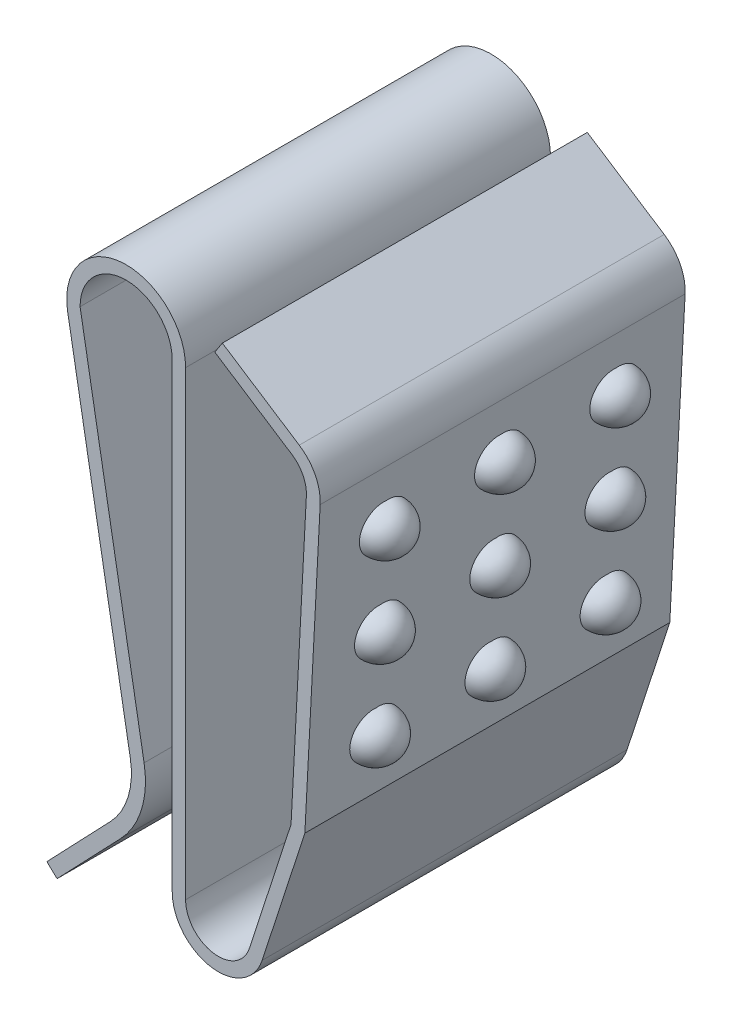
ISO-10303-21;
HEADER;
FILE_DESCRIPTION(('STEP AP214'),'2;1');
FILE_NAME('part.step','',(''),(''),'','','');
FILE_SCHEMA(('AUTOMOTIVE_DESIGN { 1 0 10303 214 1 1 1 1 }'));
ENDSEC;
DATA;
#1=APPLICATION_CONTEXT('core data for automotive mechanical design processes');
#2=APPLICATION_PROTOCOL_DEFINITION('international standard','automotive_design',2000,#1);
#3=PRODUCT_CONTEXT('',#1,'mechanical');
#4=PRODUCT('Part','Part','',(#3));
#5=PRODUCT_RELATED_PRODUCT_CATEGORY('part','',(#4));
#6=PRODUCT_DEFINITION_FORMATION('','',#4);
#7=PRODUCT_DEFINITION_CONTEXT('part definition',#1,'design');
#8=PRODUCT_DEFINITION('design','',#6,#7);
#9=PRODUCT_DEFINITION_SHAPE('','',#8);
#10=(LENGTH_UNIT() NAMED_UNIT(*) SI_UNIT(.MILLI.,.METRE.));
#11=(NAMED_UNIT(*) PLANE_ANGLE_UNIT() SI_UNIT($,.RADIAN.));
#12=(NAMED_UNIT(*) SI_UNIT($,.STERADIAN.) SOLID_ANGLE_UNIT());
#13=UNCERTAINTY_MEASURE_WITH_UNIT(LENGTH_MEASURE(1.E-05),#10,'distance_accuracy_value','');
#14=(GEOMETRIC_REPRESENTATION_CONTEXT(3) GLOBAL_UNCERTAINTY_ASSIGNED_CONTEXT((#13)) GLOBAL_UNIT_ASSIGNED_CONTEXT((#10,
#11,#12)) REPRESENTATION_CONTEXT('',''));
#15=CARTESIAN_POINT('',(0.,0.,0.));
#16=DIRECTION('',(0.,0.,1.));
#17=DIRECTION('',(1.,0.,0.));
#18=AXIS2_PLACEMENT_3D('',#15,#16,#17);
#19=CARTESIAN_POINT('',(0.,0.,7.91999999999999));
#20=DIRECTION('',(0.,0.,1.));
#21=DIRECTION('',(0.,-1.,0.));
#22=AXIS2_PLACEMENT_3D('',#19,#20,#21);
#23=PLANE('',#22);
#24=DIRECTION('',(0.,-1.,0.));
#25=VECTOR('',#24,1.);
#26=CARTESIAN_POINT('',(0.,5.,7.92));
#27=LINE('',#26,#25);
#28=CARTESIAN_POINT('',(0.,5.,7.92));
#29=VERTEX_POINT('',#28);
#30=CARTESIAN_POINT('',(0.,-5.,7.92));
#31=VERTEX_POINT('',#30);
#32=EDGE_CURVE('E282',#29,#31,#27,.T.);
#33=ORIENTED_EDGE('',*,*,#32,.T.);
#34=CARTESIAN_POINT('',(1.,-5.,7.92));
#35=DIRECTION('',(0.,0.,1.));
#36=DIRECTION('',(1.,0.,0.));
#37=AXIS2_PLACEMENT_3D('',#34,#35,#36);
#38=CIRCLE('',#37,1.);
#39=CARTESIAN_POINT('',(1.95105651629516,-5.30901699437494,7.91999999999999));
#40=VERTEX_POINT('',#39);
#41=EDGE_CURVE('E43',#31,#40,#38,.T.);
#42=ORIENTED_EDGE('',*,*,#41,.T.);
#43=DIRECTION('',(0.309016994374941,0.951056516295155,0.));
#44=VECTOR('',#43,1.);
#45=CARTESIAN_POINT('',(1.95105651629516,-5.30901699437494,7.91999999999999));
#46=LINE('',#45,#44);
#47=CARTESIAN_POINT('',(2.87810749941998,-2.45584744548947,7.91999999999999));
#48=VERTEX_POINT('',#47);
#49=EDGE_CURVE('E301',#40,#48,#46,.T.);
#50=ORIENTED_EDGE('',*,*,#49,.T.);
#51=DIRECTION('',(0.0523359562429509,0.998629534754574,0.));
#52=VECTOR('',#51,1.);
#53=CARTESIAN_POINT('',(2.87810749941998,-2.45584744548947,7.91999999999999));
#54=LINE('',#53,#52);
#55=CARTESIAN_POINT('',(3.21044082156272,3.88545010020207,7.91999999999999));
#56=VERTEX_POINT('',#55);
#57=EDGE_CURVE('E321',#48,#56,#54,.T.);
#58=ORIENTED_EDGE('',*,*,#57,.T.);
#59=CARTESIAN_POINT('',(2.21181128680814,3.93778605644502,7.92));
#60=DIRECTION('',(0.,0.,1.));
#61=DIRECTION('',(0.,-1.,0.));
#62=AXIS2_PLACEMENT_3D('',#59,#60,#61);
#63=CIRCLE('',#62,1.);
#64=CARTESIAN_POINT('',(2.75645032182317,4.77645662439044,7.91999999999999));
#65=VERTEX_POINT('',#64);
#66=EDGE_CURVE('E335',#56,#65,#63,.T.);
#67=ORIENTED_EDGE('',*,*,#66,.T.);
#68=DIRECTION('',(-0.838670567945422,0.54463903501503,0.));
#69=VECTOR('',#68,1.);
#70=CARTESIAN_POINT('',(2.75645032182317,4.77645662439044,7.91999999999999));
#71=LINE('',#70,#69);
#72=CARTESIAN_POINT('',(1.08749589161179,5.86028830407035,7.91999999999999));
#73=VERTEX_POINT('',#72);
#74=EDGE_CURVE('E349',#65,#73,#71,.T.);
#75=ORIENTED_EDGE('',*,*,#74,.T.);
#76=DIRECTION('',(-0.544639035015031,-0.838670567945421,0.));
#77=VECTOR('',#76,1.);
#78=CARTESIAN_POINT('',(0.924104181107277,5.60868713368673,7.91999999999999));
#79=LINE('',#78,#77);
#80=CARTESIAN_POINT('',(0.924104181107277,5.60868713368673,7.91999999999999));
#81=VERTEX_POINT('',#80);
#82=EDGE_CURVE('E363',#73,#81,#79,.T.);
#83=ORIENTED_EDGE('',*,*,#82,.T.);
#84=DIRECTION('',(0.838670567945422,-0.54463903501503,0.));
#85=VECTOR('',#84,1.);
#86=CARTESIAN_POINT('',(2.59305861131867,4.52485545400682,7.91999999999999));
#87=LINE('',#86,#85);
#88=CARTESIAN_POINT('',(2.59305861131867,4.52485545400682,7.91999999999999));
#89=VERTEX_POINT('',#88);
#90=EDGE_CURVE('E377',#81,#89,#87,.T.);
#91=ORIENTED_EDGE('',*,*,#90,.T.);
#92=CARTESIAN_POINT('',(2.21181128680814,3.93778605644502,7.92));
#93=DIRECTION('',(0.,0.,-1.));
#94=DIRECTION('',(-1.,0.,0.));
#95=AXIS2_PLACEMENT_3D('',#92,#93,#94);
#96=CIRCLE('',#95,0.700000000000003);
#97=CARTESIAN_POINT('',(2.91085196113635,3.90115088707495,7.91999999999999));
#98=VERTEX_POINT('',#97);
#99=EDGE_CURVE('E391',#89,#98,#96,.T.);
#100=ORIENTED_EDGE('',*,*,#99,.T.);
#101=DIRECTION('',(-0.0523359562429511,-0.998629534754574,0.));
#102=VECTOR('',#101,1.);
#103=CARTESIAN_POINT('',(2.91085196113635,3.90115088707495,7.91999999999999));
#104=LINE('',#103,#102);
#105=CARTESIAN_POINT('',(2.57851863899361,-2.44014665861659,7.92));
#106=VERTEX_POINT('',#105);
#107=EDGE_CURVE('E405',#98,#106,#104,.T.);
#108=ORIENTED_EDGE('',*,*,#107,.T.);
#109=DIRECTION('',(-0.309016994374943,-0.951056516295155,0.));
#110=VECTOR('',#109,1.);
#111=CARTESIAN_POINT('',(1.67546150089015,-5.21947074568625,7.91999999999999));
#112=LINE('',#111,#110);
#113=CARTESIAN_POINT('',(1.67546150089015,-5.21947074568625,7.91999999999999));
#114=VERTEX_POINT('',#113);
#115=EDGE_CURVE('E419',#106,#114,#112,.T.);
#116=ORIENTED_EDGE('',*,*,#115,.T.);
#117=CARTESIAN_POINT('',(1.,-5.,7.91999999999999));
#118=DIRECTION('',(0.,0.,-1.));
#119=DIRECTION('',(1.,0.,0.));
#120=AXIS2_PLACEMENT_3D('',#117,#118,#119);
#121=CIRCLE('',#120,0.710222252113277);
#122=CARTESIAN_POINT('',(0.289777747886723,-5.,7.92));
#123=VERTEX_POINT('',#122);
#124=EDGE_CURVE('E433',#114,#123,#121,.T.);
#125=ORIENTED_EDGE('',*,*,#124,.T.);
#126=DIRECTION('',(0.,1.,0.));
#127=VECTOR('',#126,1.);
#128=CARTESIAN_POINT('',(0.289777747886723,5.,7.92));
#129=LINE('',#128,#127);
#130=CARTESIAN_POINT('',(0.289777747886724,5.,7.92));
#131=VERTEX_POINT('',#130);
#132=EDGE_CURVE('E447',#123,#131,#129,.T.);
#133=ORIENTED_EDGE('',*,*,#132,.T.);
#134=CARTESIAN_POINT('',(-1.,5.,7.92));
#135=DIRECTION('',(0.,0.,1.));
#136=DIRECTION('',(0.,1.,0.));
#137=AXIS2_PLACEMENT_3D('',#134,#135,#136);
#138=CIRCLE('',#137,1.28977774788672);
#139=CARTESIAN_POINT('',(-2.27018312578147,4.77603244448412,7.92));
#140=VERTEX_POINT('',#139);
#141=EDGE_CURVE('E461',#131,#140,#138,.T.);
#142=ORIENTED_EDGE('',*,*,#141,.T.);
#143=DIRECTION('',(0.173648177666925,-0.984807753012209,0.));
#144=VECTOR('',#143,1.);
#145=CARTESIAN_POINT('',(-0.911151394053116,-2.93141950795072,7.92));
#146=LINE('',#145,#144);
#147=CARTESIAN_POINT('',(-0.911151394053116,-2.93141950795072,7.92));
#148=VERTEX_POINT('',#147);
#149=EDGE_CURVE('E475',#140,#148,#146,.T.);
#150=ORIENTED_EDGE('',*,*,#149,.T.);
#151=CARTESIAN_POINT('',(-2.51953591691729,-3.21502109468558,7.92));
#152=DIRECTION('',(0.,0.,-1.));
#153=DIRECTION('',(0.,-1.,0.));
#154=AXIS2_PLACEMENT_3D('',#151,#152,#153);
#155=CIRCLE('',#154,1.63319644666144);
#156=CARTESIAN_POINT('',(-1.33876015090784,-4.343338081969,7.92));
#157=VERTEX_POINT('',#156);
#158=EDGE_CURVE('E489',#148,#157,#155,.T.);
#159=ORIENTED_EDGE('',*,*,#158,.T.);
#160=DIRECTION('',(-0.690864218808407,-0.72298453038101,0.));
#161=VECTOR('',#160,1.);
#162=CARTESIAN_POINT('',(-2.72048858852465,-5.78930714273102,7.92));
#163=LINE('',#162,#161);
#164=CARTESIAN_POINT('',(-2.72048858852465,-5.78930714273102,7.92));
#165=VERTEX_POINT('',#164);
#166=EDGE_CURVE('E503',#157,#165,#163,.T.);
#167=ORIENTED_EDGE('',*,*,#166,.T.);
#168=DIRECTION('',(0.722984530381008,-0.690864218808408,0.));
#169=VECTOR('',#168,1.);
#170=CARTESIAN_POINT('',(-2.5,-6.,7.92));
#171=LINE('',#170,#169);
#172=CARTESIAN_POINT('',(-2.5,-6.,7.92));
#173=VERTEX_POINT('',#172);
#174=EDGE_CURVE('E517',#165,#173,#171,.T.);
#175=ORIENTED_EDGE('',*,*,#174,.T.);
#176=DIRECTION('',(0.690864218808406,0.722984530381011,0.));
#177=VECTOR('',#176,1.);
#178=CARTESIAN_POINT('',(-1.11827156238319,-4.55403093923798,7.92));
#179=LINE('',#178,#177);
#180=CARTESIAN_POINT('',(-1.11827156238319,-4.55403093923798,7.92));
#181=VERTEX_POINT('',#180);
#182=EDGE_CURVE('E531',#173,#181,#179,.T.);
#183=ORIENTED_EDGE('',*,*,#182,.T.);
#184=CARTESIAN_POINT('',(-2.51953591691729,-3.21502109468558,7.92));
#185=DIRECTION('',(0.,0.,1.));
#186=DIRECTION('',(0.,1.,0.));
#187=AXIS2_PLACEMENT_3D('',#184,#185,#186);
#188=CIRCLE('',#187,1.93816644153595);
#189=CARTESIAN_POINT('',(-0.610814578664601,-2.87846202409767,7.92));
#190=VERTEX_POINT('',#189);
#191=EDGE_CURVE('E545',#181,#190,#188,.T.);
#192=ORIENTED_EDGE('',*,*,#191,.T.);
#193=DIRECTION('',(-0.173648177666925,0.984807753012209,0.));
#194=VECTOR('',#193,1.);
#195=CARTESIAN_POINT('',(-2.,5.,7.92));
#196=LINE('',#195,#194);
#197=CARTESIAN_POINT('',(-2.,5.,7.92));
#198=VERTEX_POINT('',#197);
#199=EDGE_CURVE('E559',#190,#198,#196,.T.);
#200=ORIENTED_EDGE('',*,*,#199,.T.);
#201=CARTESIAN_POINT('',(-1.,5.,7.92));
#202=DIRECTION('',(0.,0.,-1.));
#203=DIRECTION('',(1.,0.,0.));
#204=AXIS2_PLACEMENT_3D('',#201,#202,#203);
#205=CIRCLE('',#204,1.);
#206=EDGE_CURVE('E286',#198,#29,#205,.T.);
#207=ORIENTED_EDGE('',*,*,#206,.T.);
#208=EDGE_LOOP('',(#33,#42,#50,#58,#67,#75,#83,#91,#100,#108,#116,#125,#133,#142,#150,#159,#167,
#175,#183,#192,#200,#207));
#209=FACE_BOUND('',#208,.T.);
#210=ADVANCED_FACE('F35',(#209),#23,.T.);
#211=CARTESIAN_POINT('',(0.,0.,0.));
#212=DIRECTION('',(0.,0.,1.));
#213=DIRECTION('',(0.,-1.,0.));
#214=AXIS2_PLACEMENT_3D('',#211,#212,#213);
#215=PLANE('',#214);
#216=DIRECTION('',(0.,-1.,0.));
#217=VECTOR('',#216,1.);
#218=CARTESIAN_POINT('',(0.,5.,0.));
#219=LINE('',#218,#217);
#220=CARTESIAN_POINT('',(0.,5.,0.));
#221=VERTEX_POINT('',#220);
#222=CARTESIAN_POINT('',(0.,-5.,0.));
#223=VERTEX_POINT('',#222);
#224=EDGE_CURVE('E287',#221,#223,#219,.T.);
#225=ORIENTED_EDGE('',*,*,#224,.F.);
#226=CARTESIAN_POINT('',(-1.,5.,0.));
#227=DIRECTION('',(0.,0.,-1.));
#228=DIRECTION('',(1.,0.,0.));
#229=AXIS2_PLACEMENT_3D('',#226,#227,#228);
#230=CIRCLE('',#229,1.);
#231=CARTESIAN_POINT('',(-2.,5.,0.));
#232=VERTEX_POINT('',#231);
#233=EDGE_CURVE('E567',#232,#221,#230,.T.);
#234=ORIENTED_EDGE('',*,*,#233,.F.);
#235=DIRECTION('',(-0.173648177666925,0.984807753012209,0.));
#236=VECTOR('',#235,1.);
#237=CARTESIAN_POINT('',(-2.,5.,0.));
#238=LINE('',#237,#236);
#239=CARTESIAN_POINT('',(-0.610814578664601,-2.87846202409767,0.));
#240=VERTEX_POINT('',#239);
#241=EDGE_CURVE('E553',#240,#232,#238,.T.);
#242=ORIENTED_EDGE('',*,*,#241,.F.);
#243=CARTESIAN_POINT('',(-2.51953591691729,-3.21502109468558,0.));
#244=DIRECTION('',(0.,0.,1.));
#245=DIRECTION('',(0.,1.,0.));
#246=AXIS2_PLACEMENT_3D('',#243,#244,#245);
#247=CIRCLE('',#246,1.93816644153595);
#248=CARTESIAN_POINT('',(-1.11827156238319,-4.55403093923798,0.));
#249=VERTEX_POINT('',#248);
#250=EDGE_CURVE('E539',#249,#240,#247,.T.);
#251=ORIENTED_EDGE('',*,*,#250,.F.);
#252=DIRECTION('',(0.690864218808406,0.722984530381011,0.));
#253=VECTOR('',#252,1.);
#254=CARTESIAN_POINT('',(-1.11827156238319,-4.55403093923798,0.));
#255=LINE('',#254,#253);
#256=CARTESIAN_POINT('',(-2.5,-6.,0.));
#257=VERTEX_POINT('',#256);
#258=EDGE_CURVE('E525',#257,#249,#255,.T.);
#259=ORIENTED_EDGE('',*,*,#258,.F.);
#260=DIRECTION('',(0.722984530381008,-0.690864218808408,0.));
#261=VECTOR('',#260,1.);
#262=CARTESIAN_POINT('',(-2.5,-6.,0.));
#263=LINE('',#262,#261);
#264=CARTESIAN_POINT('',(-2.72048858852465,-5.78930714273102,0.));
#265=VERTEX_POINT('',#264);
#266=EDGE_CURVE('E511',#265,#257,#263,.T.);
#267=ORIENTED_EDGE('',*,*,#266,.F.);
#268=DIRECTION('',(-0.690864218808407,-0.72298453038101,0.));
#269=VECTOR('',#268,1.);
#270=CARTESIAN_POINT('',(-2.72048858852465,-5.78930714273102,0.));
#271=LINE('',#270,#269);
#272=CARTESIAN_POINT('',(-1.33876015090784,-4.343338081969,0.));
#273=VERTEX_POINT('',#272);
#274=EDGE_CURVE('E497',#273,#265,#271,.T.);
#275=ORIENTED_EDGE('',*,*,#274,.F.);
#276=CARTESIAN_POINT('',(-2.51953591691729,-3.21502109468558,0.));
#277=DIRECTION('',(0.,0.,-1.));
#278=DIRECTION('',(0.,-1.,0.));
#279=AXIS2_PLACEMENT_3D('',#276,#277,#278);
#280=CIRCLE('',#279,1.63319644666144);
#281=CARTESIAN_POINT('',(-0.911151394053116,-2.93141950795072,0.));
#282=VERTEX_POINT('',#281);
#283=EDGE_CURVE('E483',#282,#273,#280,.T.);
#284=ORIENTED_EDGE('',*,*,#283,.F.);
#285=DIRECTION('',(0.173648177666925,-0.984807753012209,0.));
#286=VECTOR('',#285,1.);
#287=CARTESIAN_POINT('',(-0.911151394053116,-2.93141950795072,0.));
#288=LINE('',#287,#286);
#289=CARTESIAN_POINT('',(-2.27018312578147,4.77603244448412,0.));
#290=VERTEX_POINT('',#289);
#291=EDGE_CURVE('E469',#290,#282,#288,.T.);
#292=ORIENTED_EDGE('',*,*,#291,.F.);
#293=CARTESIAN_POINT('',(-1.,5.,0.));
#294=DIRECTION('',(0.,0.,1.));
#295=DIRECTION('',(0.,1.,0.));
#296=AXIS2_PLACEMENT_3D('',#293,#294,#295);
#297=CIRCLE('',#296,1.28977774788672);
#298=CARTESIAN_POINT('',(0.289777747886724,5.,0.));
#299=VERTEX_POINT('',#298);
#300=EDGE_CURVE('E455',#299,#290,#297,.T.);
#301=ORIENTED_EDGE('',*,*,#300,.F.);
#302=DIRECTION('',(0.,1.,0.));
#303=VECTOR('',#302,1.);
#304=CARTESIAN_POINT('',(0.289777747886723,5.,0.));
#305=LINE('',#304,#303);
#306=CARTESIAN_POINT('',(0.289777747886723,-5.,0.));
#307=VERTEX_POINT('',#306);
#308=EDGE_CURVE('E441',#307,#299,#305,.T.);
#309=ORIENTED_EDGE('',*,*,#308,.F.);
#310=CARTESIAN_POINT('',(1.,-5.,0.));
#311=DIRECTION('',(0.,0.,-1.));
#312=DIRECTION('',(1.,0.,0.));
#313=AXIS2_PLACEMENT_3D('',#310,#311,#312);
#314=CIRCLE('',#313,0.710222252113277);
#315=CARTESIAN_POINT('',(1.67546150089015,-5.21947074568625,0.));
#316=VERTEX_POINT('',#315);
#317=EDGE_CURVE('E427',#316,#307,#314,.T.);
#318=ORIENTED_EDGE('',*,*,#317,.F.);
#319=DIRECTION('',(-0.309016994374943,-0.951056516295155,0.));
#320=VECTOR('',#319,1.);
#321=CARTESIAN_POINT('',(1.67546150089015,-5.21947074568625,0.));
#322=LINE('',#321,#320);
#323=CARTESIAN_POINT('',(2.57851863899361,-2.44014665861659,0.));
#324=VERTEX_POINT('',#323);
#325=EDGE_CURVE('E413',#324,#316,#322,.T.);
#326=ORIENTED_EDGE('',*,*,#325,.F.);
#327=DIRECTION('',(-0.0523359562429511,-0.998629534754574,0.));
#328=VECTOR('',#327,1.);
#329=CARTESIAN_POINT('',(2.91085196113635,3.90115088707495,0.));
#330=LINE('',#329,#328);
#331=CARTESIAN_POINT('',(2.91085196113635,3.90115088707495,0.));
#332=VERTEX_POINT('',#331);
#333=EDGE_CURVE('E399',#332,#324,#330,.T.);
#334=ORIENTED_EDGE('',*,*,#333,.F.);
#335=CARTESIAN_POINT('',(2.21181128680814,3.93778605644502,0.));
#336=DIRECTION('',(0.,0.,-1.));
#337=DIRECTION('',(-1.,0.,0.));
#338=AXIS2_PLACEMENT_3D('',#335,#336,#337);
#339=CIRCLE('',#338,0.700000000000003);
#340=CARTESIAN_POINT('',(2.59305861131867,4.52485545400682,0.));
#341=VERTEX_POINT('',#340);
#342=EDGE_CURVE('E385',#341,#332,#339,.T.);
#343=ORIENTED_EDGE('',*,*,#342,.F.);
#344=DIRECTION('',(0.838670567945422,-0.54463903501503,0.));
#345=VECTOR('',#344,1.);
#346=CARTESIAN_POINT('',(2.59305861131867,4.52485545400682,0.));
#347=LINE('',#346,#345);
#348=CARTESIAN_POINT('',(0.924104181107277,5.60868713368673,0.));
#349=VERTEX_POINT('',#348);
#350=EDGE_CURVE('E371',#349,#341,#347,.T.);
#351=ORIENTED_EDGE('',*,*,#350,.F.);
#352=DIRECTION('',(-0.544639035015031,-0.838670567945421,0.));
#353=VECTOR('',#352,1.);
#354=CARTESIAN_POINT('',(0.924104181107277,5.60868713368673,0.));
#355=LINE('',#354,#353);
#356=CARTESIAN_POINT('',(1.08749589161179,5.86028830407035,0.));
#357=VERTEX_POINT('',#356);
#358=EDGE_CURVE('E357',#357,#349,#355,.T.);
#359=ORIENTED_EDGE('',*,*,#358,.F.);
#360=DIRECTION('',(-0.838670567945422,0.54463903501503,0.));
#361=VECTOR('',#360,1.);
#362=CARTESIAN_POINT('',(2.75645032182317,4.77645662439044,0.));
#363=LINE('',#362,#361);
#364=CARTESIAN_POINT('',(2.75645032182317,4.77645662439044,0.));
#365=VERTEX_POINT('',#364);
#366=EDGE_CURVE('E343',#365,#357,#363,.T.);
#367=ORIENTED_EDGE('',*,*,#366,.F.);
#368=CARTESIAN_POINT('',(2.21181128680814,3.93778605644502,0.));
#369=DIRECTION('',(0.,0.,1.));
#370=DIRECTION('',(0.,-1.,0.));
#371=AXIS2_PLACEMENT_3D('',#368,#369,#370);
#372=CIRCLE('',#371,1.);
#373=CARTESIAN_POINT('',(3.21044082156272,3.88545010020207,0.));
#374=VERTEX_POINT('',#373);
#375=EDGE_CURVE('E329',#374,#365,#372,.T.);
#376=ORIENTED_EDGE('',*,*,#375,.F.);
#377=DIRECTION('',(0.0523359562429509,0.998629534754574,0.));
#378=VECTOR('',#377,1.);
#379=CARTESIAN_POINT('',(2.87810749941998,-2.45584744548947,0.));
#380=LINE('',#379,#378);
#381=CARTESIAN_POINT('',(2.87810749941998,-2.45584744548947,0.));
#382=VERTEX_POINT('',#381);
#383=EDGE_CURVE('E315',#382,#374,#380,.T.);
#384=ORIENTED_EDGE('',*,*,#383,.F.);
#385=DIRECTION('',(0.309016994374941,0.951056516295155,0.));
#386=VECTOR('',#385,1.);
#387=CARTESIAN_POINT('',(1.95105651629516,-5.30901699437494,0.));
#388=LINE('',#387,#386);
#389=CARTESIAN_POINT('',(1.95105651629516,-5.30901699437494,0.));
#390=VERTEX_POINT('',#389);
#391=EDGE_CURVE('E300',#390,#382,#388,.T.);
#392=ORIENTED_EDGE('',*,*,#391,.F.);
#393=CARTESIAN_POINT('',(1.,-5.,0.));
#394=DIRECTION('',(0.,0.,1.));
#395=DIRECTION('',(1.,0.,0.));
#396=AXIS2_PLACEMENT_3D('',#393,#394,#395);
#397=CIRCLE('',#396,1.);
#398=EDGE_CURVE('E12',#223,#390,#397,.T.);
#399=ORIENTED_EDGE('',*,*,#398,.F.);
#400=EDGE_LOOP('',(#225,#234,#242,#251,#259,#267,#275,#284,#292,#301,#309,#318,#326,#334,#343,
#351,#359,#367,#376,#384,#392,#399));
#401=FACE_BOUND('',#400,.T.);
#402=ADVANCED_FACE('F599',(#401),#215,.F.);
#403=CARTESIAN_POINT('',(0.,5.,0.));
#404=DIRECTION('',(-1.,0.,0.));
#405=DIRECTION('',(0.,-1.,0.));
#406=AXIS2_PLACEMENT_3D('',#403,#404,#405);
#407=PLANE('',#406);
#408=ORIENTED_EDGE('',*,*,#32,.F.);
#409=DIRECTION('',(0.,0.,1.));
#410=VECTOR('',#409,1.);
#411=CARTESIAN_POINT('',(0.,5.,0.));
#412=LINE('',#411,#410);
#413=EDGE_CURVE('E292',#221,#29,#412,.T.);
#414=ORIENTED_EDGE('',*,*,#413,.F.);
#415=ORIENTED_EDGE('',*,*,#224,.T.);
#416=DIRECTION('',(0.,0.,1.));
#417=VECTOR('',#416,1.);
#418=CARTESIAN_POINT('',(0.,-5.,0.));
#419=LINE('',#418,#417);
#420=EDGE_CURVE('E283',#223,#31,#419,.T.);
#421=ORIENTED_EDGE('',*,*,#420,.T.);
#422=EDGE_LOOP('',(#408,#414,#415,#421));
#423=FACE_BOUND('',#422,.T.);
#424=ADVANCED_FACE('F589',(#423),#407,.T.);
#425=CARTESIAN_POINT('',(-1.,5.,0.));
#426=DIRECTION('',(0.,0.,1.));
#427=DIRECTION('',(1.,0.,0.));
#428=AXIS2_PLACEMENT_3D('',#425,#426,#427);
#429=CYLINDRICAL_SURFACE('',#428,1.);
#430=ORIENTED_EDGE('',*,*,#206,.F.);
#431=DIRECTION('',(0.,0.,1.));
#432=VECTOR('',#431,1.);
#433=CARTESIAN_POINT('',(-2.,5.,0.));
#434=LINE('',#433,#432);
#435=EDGE_CURVE('E570',#232,#198,#434,.T.);
#436=ORIENTED_EDGE('',*,*,#435,.F.);
#437=ORIENTED_EDGE('',*,*,#233,.T.);
#438=ORIENTED_EDGE('',*,*,#413,.T.);
#439=EDGE_LOOP('',(#430,#436,#437,#438));
#440=FACE_BOUND('',#439,.T.);
#441=ADVANCED_FACE('F586',(#440),#429,.F.);
#442=CARTESIAN_POINT('',(-2.,5.,0.));
#443=DIRECTION('',(0.984807753012209,0.173648177666925,0.));
#444=DIRECTION('',(-0.173648177666925,0.984807753012209,0.));
#445=AXIS2_PLACEMENT_3D('',#442,#443,#444);
#446=PLANE('',#445);
#447=ORIENTED_EDGE('',*,*,#199,.F.);
#448=DIRECTION('',(0.,0.,1.));
#449=VECTOR('',#448,1.);
#450=CARTESIAN_POINT('',(-0.610814578664601,-2.87846202409767,0.));
#451=LINE('',#450,#449);
#452=EDGE_CURVE('E556',#240,#190,#451,.T.);
#453=ORIENTED_EDGE('',*,*,#452,.F.);
#454=ORIENTED_EDGE('',*,*,#241,.T.);
#455=ORIENTED_EDGE('',*,*,#435,.T.);
#456=EDGE_LOOP('',(#447,#453,#454,#455));
#457=FACE_BOUND('',#456,.T.);
#458=ADVANCED_FACE('F597',(#457),#446,.T.);
#459=CARTESIAN_POINT('',(-2.51953591691729,-3.21502109468558,0.));
#460=DIRECTION('',(0.,0.,1.));
#461=DIRECTION('',(1.,0.,0.));
#462=AXIS2_PLACEMENT_3D('',#459,#460,#461);
#463=CYLINDRICAL_SURFACE('',#462,1.93816644153595);
#464=ORIENTED_EDGE('',*,*,#191,.F.);
#465=DIRECTION('',(0.,0.,1.));
#466=VECTOR('',#465,1.);
#467=CARTESIAN_POINT('',(-1.11827156238319,-4.55403093923798,0.));
#468=LINE('',#467,#466);
#469=EDGE_CURVE('E542',#249,#181,#468,.T.);
#470=ORIENTED_EDGE('',*,*,#469,.F.);
#471=ORIENTED_EDGE('',*,*,#250,.T.);
#472=ORIENTED_EDGE('',*,*,#452,.T.);
#473=EDGE_LOOP('',(#464,#470,#471,#472));
#474=FACE_BOUND('',#473,.T.);
#475=ADVANCED_FACE('F671',(#474),#463,.T.);
#476=CARTESIAN_POINT('',(-1.11827156238319,-4.55403093923798,0.));
#477=DIRECTION('',(0.722984530381011,-0.690864218808406,0.));
#478=DIRECTION('',(0.690864218808406,0.722984530381011,0.));
#479=AXIS2_PLACEMENT_3D('',#476,#477,#478);
#480=PLANE('',#479);
#481=ORIENTED_EDGE('',*,*,#182,.F.);
#482=DIRECTION('',(0.,0.,1.));
#483=VECTOR('',#482,1.);
#484=CARTESIAN_POINT('',(-2.5,-6.,0.));
#485=LINE('',#484,#483);
#486=EDGE_CURVE('E528',#257,#173,#485,.T.);
#487=ORIENTED_EDGE('',*,*,#486,.F.);
#488=ORIENTED_EDGE('',*,*,#258,.T.);
#489=ORIENTED_EDGE('',*,*,#469,.T.);
#490=EDGE_LOOP('',(#481,#487,#488,#489));
#491=FACE_BOUND('',#490,.T.);
#492=ADVANCED_FACE('F669',(#491),#480,.T.);
#493=CARTESIAN_POINT('',(-2.5,-6.,0.));
#494=DIRECTION('',(-0.690864218808409,-0.722984530381009,0.));
#495=DIRECTION('',(0.722984530381009,-0.690864218808409,0.));
#496=AXIS2_PLACEMENT_3D('',#493,#494,#495);
#497=PLANE('',#496);
#498=ORIENTED_EDGE('',*,*,#174,.F.);
#499=DIRECTION('',(0.,0.,1.));
#500=VECTOR('',#499,1.);
#501=CARTESIAN_POINT('',(-2.72048858852465,-5.78930714273102,0.));
#502=LINE('',#501,#500);
#503=EDGE_CURVE('E514',#265,#165,#502,.T.);
#504=ORIENTED_EDGE('',*,*,#503,.F.);
#505=ORIENTED_EDGE('',*,*,#266,.T.);
#506=ORIENTED_EDGE('',*,*,#486,.T.);
#507=EDGE_LOOP('',(#498,#504,#505,#506));
#508=FACE_BOUND('',#507,.T.);
#509=ADVANCED_FACE('F665',(#508),#497,.T.);
#510=CARTESIAN_POINT('',(-2.72048858852465,-5.78930714273102,0.));
#511=DIRECTION('',(-0.72298453038101,0.690864218808407,0.));
#512=DIRECTION('',(-0.690864218808407,-0.72298453038101,0.));
#513=AXIS2_PLACEMENT_3D('',#510,#511,#512);
#514=PLANE('',#513);
#515=ORIENTED_EDGE('',*,*,#166,.F.);
#516=DIRECTION('',(0.,0.,1.));
#517=VECTOR('',#516,1.);
#518=CARTESIAN_POINT('',(-1.33876015090784,-4.343338081969,0.));
#519=LINE('',#518,#517);
#520=EDGE_CURVE('E500',#273,#157,#519,.T.);
#521=ORIENTED_EDGE('',*,*,#520,.F.);
#522=ORIENTED_EDGE('',*,*,#274,.T.);
#523=ORIENTED_EDGE('',*,*,#503,.T.);
#524=EDGE_LOOP('',(#515,#521,#522,#523));
#525=FACE_BOUND('',#524,.T.);
#526=ADVANCED_FACE('F661',(#525),#514,.T.);
#527=CARTESIAN_POINT('',(-2.51953591691729,-3.21502109468558,0.));
#528=DIRECTION('',(0.,0.,1.));
#529=DIRECTION('',(1.,0.,0.));
#530=AXIS2_PLACEMENT_3D('',#527,#528,#529);
#531=CYLINDRICAL_SURFACE('',#530,1.63319644666144);
#532=ORIENTED_EDGE('',*,*,#158,.F.);
#533=DIRECTION('',(0.,0.,1.));
#534=VECTOR('',#533,1.);
#535=CARTESIAN_POINT('',(-0.911151394053116,-2.93141950795072,0.));
#536=LINE('',#535,#534);
#537=EDGE_CURVE('E486',#282,#148,#536,.T.);
#538=ORIENTED_EDGE('',*,*,#537,.F.);
#539=ORIENTED_EDGE('',*,*,#283,.T.);
#540=ORIENTED_EDGE('',*,*,#520,.T.);
#541=EDGE_LOOP('',(#532,#538,#539,#540));
#542=FACE_BOUND('',#541,.T.);
#543=ADVANCED_FACE('F659',(#542),#531,.F.);
#544=CARTESIAN_POINT('',(-0.911151394053116,-2.93141950795072,0.));
#545=DIRECTION('',(-0.984807753012209,-0.173648177666925,0.));
#546=DIRECTION('',(0.173648177666925,-0.984807753012209,0.));
#547=AXIS2_PLACEMENT_3D('',#544,#545,#546);
#548=PLANE('',#547);
#549=ORIENTED_EDGE('',*,*,#149,.F.);
#550=DIRECTION('',(0.,0.,1.));
#551=VECTOR('',#550,1.);
#552=CARTESIAN_POINT('',(-2.27018312578147,4.77603244448412,0.));
#553=LINE('',#552,#551);
#554=EDGE_CURVE('E472',#290,#140,#553,.T.);
#555=ORIENTED_EDGE('',*,*,#554,.F.);
#556=ORIENTED_EDGE('',*,*,#291,.T.);
#557=ORIENTED_EDGE('',*,*,#537,.T.);
#558=EDGE_LOOP('',(#549,#555,#556,#557));
#559=FACE_BOUND('',#558,.T.);
#560=ADVANCED_FACE('F653',(#559),#548,.T.);
#561=CARTESIAN_POINT('',(-1.,5.,0.));
#562=DIRECTION('',(0.,0.,1.));
#563=DIRECTION('',(1.,0.,0.));
#564=AXIS2_PLACEMENT_3D('',#561,#562,#563);
#565=CYLINDRICAL_SURFACE('',#564,1.28977774788672);
#566=ORIENTED_EDGE('',*,*,#141,.F.);
#567=DIRECTION('',(0.,0.,1.));
#568=VECTOR('',#567,1.);
#569=CARTESIAN_POINT('',(0.289777747886724,5.,0.));
#570=LINE('',#569,#568);
#571=EDGE_CURVE('E458',#299,#131,#570,.T.);
#572=ORIENTED_EDGE('',*,*,#571,.F.);
#573=ORIENTED_EDGE('',*,*,#300,.T.);
#574=ORIENTED_EDGE('',*,*,#554,.T.);
#575=EDGE_LOOP('',(#566,#572,#573,#574));
#576=FACE_BOUND('',#575,.T.);
#577=ADVANCED_FACE('F649',(#576),#565,.T.);
#578=CARTESIAN_POINT('',(0.289777747886723,5.,0.));
#579=DIRECTION('',(1.,0.,0.));
#580=DIRECTION('',(0.,0.,-1.));
#581=AXIS2_PLACEMENT_3D('',#578,#579,#580);
#582=PLANE('',#581);
#583=ORIENTED_EDGE('',*,*,#132,.F.);
#584=DIRECTION('',(0.,0.,1.));
#585=VECTOR('',#584,1.);
#586=CARTESIAN_POINT('',(0.289777747886723,-5.,0.));
#587=LINE('',#586,#585);
#588=EDGE_CURVE('E444',#307,#123,#587,.T.);
#589=ORIENTED_EDGE('',*,*,#588,.F.);
#590=ORIENTED_EDGE('',*,*,#308,.T.);
#591=ORIENTED_EDGE('',*,*,#571,.T.);
#592=EDGE_LOOP('',(#583,#589,#590,#591));
#593=FACE_BOUND('',#592,.T.);
#594=ADVANCED_FACE('F647',(#593),#582,.T.);
#595=CARTESIAN_POINT('',(1.,-5.,0.));
#596=DIRECTION('',(0.,0.,1.));
#597=DIRECTION('',(1.,0.,0.));
#598=AXIS2_PLACEMENT_3D('',#595,#596,#597);
#599=CYLINDRICAL_SURFACE('',#598,0.710222252113277);
#600=ORIENTED_EDGE('',*,*,#124,.F.);
#601=DIRECTION('',(0.,0.,1.));
#602=VECTOR('',#601,1.);
#603=CARTESIAN_POINT('',(1.67546150089015,-5.21947074568625,0.));
#604=LINE('',#603,#602);
#605=EDGE_CURVE('E430',#316,#114,#604,.T.);
#606=ORIENTED_EDGE('',*,*,#605,.F.);
#607=ORIENTED_EDGE('',*,*,#317,.T.);
#608=ORIENTED_EDGE('',*,*,#588,.T.);
#609=EDGE_LOOP('',(#600,#606,#607,#608));
#610=FACE_BOUND('',#609,.T.);
#611=ADVANCED_FACE('F641',(#610),#599,.F.);
#612=CARTESIAN_POINT('',(1.67546150089015,-5.21947074568625,0.));
#613=DIRECTION('',(-0.951056516295155,0.309016994374943,0.));
#614=DIRECTION('',(-0.309016994374943,-0.951056516295155,0.));
#615=AXIS2_PLACEMENT_3D('',#612,#613,#614);
#616=PLANE('',#615);
#617=ORIENTED_EDGE('',*,*,#115,.F.);
#618=DIRECTION('',(0.,0.,1.));
#619=VECTOR('',#618,1.);
#620=CARTESIAN_POINT('',(2.57851863899361,-2.44014665861659,0.));
#621=LINE('',#620,#619);
#622=EDGE_CURVE('E416',#324,#106,#621,.T.);
#623=ORIENTED_EDGE('',*,*,#622,.F.);
#624=ORIENTED_EDGE('',*,*,#325,.T.);
#625=ORIENTED_EDGE('',*,*,#605,.T.);
#626=EDGE_LOOP('',(#617,#623,#624,#625));
#627=FACE_BOUND('',#626,.T.);
#628=ADVANCED_FACE('F637',(#627),#616,.T.);
#629=CARTESIAN_POINT('',(2.91085196113635,3.90115088707495,0.));
#630=DIRECTION('',(-0.998629534754574,0.0523359562429511,0.));
#631=DIRECTION('',(-0.0523359562429511,-0.998629534754574,0.));
#632=AXIS2_PLACEMENT_3D('',#629,#630,#631);
#633=PLANE('',#632);
#634=ORIENTED_EDGE('',*,*,#107,.F.);
#635=DIRECTION('',(0.,0.,1.));
#636=VECTOR('',#635,1.);
#637=CARTESIAN_POINT('',(2.91085196113635,3.90115088707495,0.));
#638=LINE('',#637,#636);
#639=EDGE_CURVE('E402',#332,#98,#638,.T.);
#640=ORIENTED_EDGE('',*,*,#639,.F.);
#641=ORIENTED_EDGE('',*,*,#333,.T.);
#642=ORIENTED_EDGE('',*,*,#622,.T.);
#643=EDGE_LOOP('',(#634,#640,#641,#642));
#644=FACE_BOUND('',#643,.T.);
#645=ADVANCED_FACE('F635',(#644),#633,.T.);
#646=CARTESIAN_POINT('',(2.21181128680814,3.93778605644502,0.));
#647=DIRECTION('',(0.,0.,1.));
#648=DIRECTION('',(1.,0.,0.));
#649=AXIS2_PLACEMENT_3D('',#646,#647,#648);
#650=CYLINDRICAL_SURFACE('',#649,0.700000000000003);
#651=ORIENTED_EDGE('',*,*,#99,.F.);
#652=DIRECTION('',(0.,0.,1.));
#653=VECTOR('',#652,1.);
#654=CARTESIAN_POINT('',(2.59305861131867,4.52485545400682,0.));
#655=LINE('',#654,#653);
#656=EDGE_CURVE('E388',#341,#89,#655,.T.);
#657=ORIENTED_EDGE('',*,*,#656,.F.);
#658=ORIENTED_EDGE('',*,*,#342,.T.);
#659=ORIENTED_EDGE('',*,*,#639,.T.);
#660=EDGE_LOOP('',(#651,#657,#658,#659));
#661=FACE_BOUND('',#660,.T.);
#662=ADVANCED_FACE('F629',(#661),#650,.F.);
#663=CARTESIAN_POINT('',(2.59305861131867,4.52485545400682,0.));
#664=DIRECTION('',(-0.54463903501503,-0.838670567945422,0.));
#665=DIRECTION('',(0.838670567945422,-0.54463903501503,0.));
#666=AXIS2_PLACEMENT_3D('',#663,#664,#665);
#667=PLANE('',#666);
#668=ORIENTED_EDGE('',*,*,#90,.F.);
#669=DIRECTION('',(0.,0.,1.));
#670=VECTOR('',#669,1.);
#671=CARTESIAN_POINT('',(0.924104181107277,5.60868713368673,0.));
#672=LINE('',#671,#670);
#673=EDGE_CURVE('E374',#349,#81,#672,.T.);
#674=ORIENTED_EDGE('',*,*,#673,.F.);
#675=ORIENTED_EDGE('',*,*,#350,.T.);
#676=ORIENTED_EDGE('',*,*,#656,.T.);
#677=EDGE_LOOP('',(#668,#674,#675,#676));
#678=FACE_BOUND('',#677,.T.);
#679=ADVANCED_FACE('F625',(#678),#667,.T.);
#680=CARTESIAN_POINT('',(0.924104181107277,5.60868713368673,0.));
#681=DIRECTION('',(-0.838670567945422,0.544639035015031,0.));
#682=DIRECTION('',(-0.544639035015031,-0.838670567945422,0.));
#683=AXIS2_PLACEMENT_3D('',#680,#681,#682);
#684=PLANE('',#683);
#685=ORIENTED_EDGE('',*,*,#82,.F.);
#686=DIRECTION('',(0.,0.,1.));
#687=VECTOR('',#686,1.);
#688=CARTESIAN_POINT('',(1.08749589161179,5.86028830407035,0.));
#689=LINE('',#688,#687);
#690=EDGE_CURVE('E360',#357,#73,#689,.T.);
#691=ORIENTED_EDGE('',*,*,#690,.F.);
#692=ORIENTED_EDGE('',*,*,#358,.T.);
#693=ORIENTED_EDGE('',*,*,#673,.T.);
#694=EDGE_LOOP('',(#685,#691,#692,#693));
#695=FACE_BOUND('',#694,.T.);
#696=ADVANCED_FACE('F623',(#695),#684,.T.);
#697=CARTESIAN_POINT('',(2.75645032182317,4.77645662439044,0.));
#698=DIRECTION('',(0.544639035015031,0.838670567945422,0.));
#699=DIRECTION('',(-0.838670567945422,0.54463903501503,0.));
#700=AXIS2_PLACEMENT_3D('',#697,#698,#699);
#701=PLANE('',#700);
#702=ORIENTED_EDGE('',*,*,#74,.F.);
#703=DIRECTION('',(0.,0.,1.));
#704=VECTOR('',#703,1.);
#705=CARTESIAN_POINT('',(2.75645032182317,4.77645662439044,0.));
#706=LINE('',#705,#704);
#707=EDGE_CURVE('E346',#365,#65,#706,.T.);
#708=ORIENTED_EDGE('',*,*,#707,.F.);
#709=ORIENTED_EDGE('',*,*,#366,.T.);
#710=ORIENTED_EDGE('',*,*,#690,.T.);
#711=EDGE_LOOP('',(#702,#708,#709,#710));
#712=FACE_BOUND('',#711,.T.);
#713=ADVANCED_FACE('F617',(#712),#701,.T.);
#714=CARTESIAN_POINT('',(2.21181128680814,3.93778605644502,0.));
#715=DIRECTION('',(0.,0.,1.));
#716=DIRECTION('',(1.,0.,0.));
#717=AXIS2_PLACEMENT_3D('',#714,#715,#716);
#718=CYLINDRICAL_SURFACE('',#717,1.);
#719=ORIENTED_EDGE('',*,*,#66,.F.);
#720=DIRECTION('',(0.,0.,1.));
#721=VECTOR('',#720,1.);
#722=CARTESIAN_POINT('',(3.21044082156272,3.88545010020207,0.));
#723=LINE('',#722,#721);
#724=EDGE_CURVE('E332',#374,#56,#723,.T.);
#725=ORIENTED_EDGE('',*,*,#724,.F.);
#726=ORIENTED_EDGE('',*,*,#375,.T.);
#727=ORIENTED_EDGE('',*,*,#707,.T.);
#728=EDGE_LOOP('',(#719,#725,#726,#727));
#729=FACE_BOUND('',#728,.T.);
#730=ADVANCED_FACE('F613',(#729),#718,.T.);
#731=CARTESIAN_POINT('',(2.87810749941998,-2.45584744548947,0.));
#732=DIRECTION('',(0.998629534754574,-0.0523359562429509,0.));
#733=DIRECTION('',(0.0523359562429509,0.998629534754574,0.));
#734=AXIS2_PLACEMENT_3D('',#731,#732,#733);
#735=PLANE('',#734);
#736=CARTESIAN_POINT('',(3.14894607297725,2.71206039686544,1.41289608222865));
#737=DIRECTION('',(-0.998629534754574,0.052335956242951,0.));
#738=DIRECTION('',(-0.052335956242951,-0.998629534754574,0.));
#739=AXIS2_PLACEMENT_3D('',#736,#737,#738);
#740=CIRCLE('',#739,0.5);
#741=CARTESIAN_POINT('',(3.17499767037583,3.2091544877613,1.45999999999999));
#742=VERTEX_POINT('',#741);
#743=CARTESIAN_POINT('',(3.12289447557868,2.21496630596959,1.46));
#744=VERTEX_POINT('',#743);
#745=EDGE_CURVE('E236',#742,#744,#740,.T.);
#746=ORIENTED_EDGE('',*,*,#745,.T.);
#747=CARTESIAN_POINT('',(3.14894607297725,2.71206039686544,1.50710391777133));
#748=DIRECTION('',(0.998629534754574,-0.0523359562429509,0.));
#749=DIRECTION('',(-0.0523359562429509,-0.998629534754574,0.));
#750=AXIS2_PLACEMENT_3D('',#747,#748,#749);
#751=CIRCLE('',#750,0.5);
#752=EDGE_CURVE('E50',#742,#744,#751,.T.);
#753=ORIENTED_EDGE('',*,*,#752,.F.);
#754=EDGE_LOOP('',(#746,#753));
#755=FACE_BOUND('',#754,.T.);
#756=CARTESIAN_POINT('',(2.93960224800545,-1.28245774215285,6.41289608222865));
#757=DIRECTION('',(-0.998629534754574,0.052335956242951,0.));
#758=DIRECTION('',(-0.052335956242951,-0.998629534754574,0.));
#759=AXIS2_PLACEMENT_3D('',#756,#757,#758);
#760=CIRCLE('',#759,0.5);
#761=CARTESIAN_POINT('',(2.96565384540403,-0.785363651257,6.45999999999999));
#762=VERTEX_POINT('',#761);
#763=CARTESIAN_POINT('',(2.91355065060687,-1.7795518330487,6.46));
#764=VERTEX_POINT('',#763);
#765=EDGE_CURVE('E245',#762,#764,#760,.T.);
#766=ORIENTED_EDGE('',*,*,#765,.T.);
#767=CARTESIAN_POINT('',(2.93960224800545,-1.28245774215285,6.50710391777134));
#768=DIRECTION('',(0.998629534754574,-0.0523359562429509,0.));
#769=DIRECTION('',(-0.0523359562429509,-0.998629534754574,0.));
#770=AXIS2_PLACEMENT_3D('',#767,#768,#769);
#771=CIRCLE('',#770,0.5);
#772=EDGE_CURVE('E57',#762,#764,#771,.T.);
#773=ORIENTED_EDGE('',*,*,#772,.F.);
#774=EDGE_LOOP('',(#766,#773));
#775=FACE_BOUND('',#774,.T.);
#776=CARTESIAN_POINT('',(2.93960224800545,-1.28245774215285,1.41289608222865));
#777=DIRECTION('',(-0.998629534754574,0.052335956242951,0.));
#778=DIRECTION('',(-0.052335956242951,-0.998629534754574,0.));
#779=AXIS2_PLACEMENT_3D('',#776,#777,#778);
#780=CIRCLE('',#779,0.5);
#781=CARTESIAN_POINT('',(2.96565384540403,-0.785363651257,1.45999999999999));
#782=VERTEX_POINT('',#781);
#783=CARTESIAN_POINT('',(2.91355065060687,-1.7795518330487,1.46));
#784=VERTEX_POINT('',#783);
#785=EDGE_CURVE('E249',#782,#784,#780,.T.);
#786=ORIENTED_EDGE('',*,*,#785,.T.);
#787=CARTESIAN_POINT('',(2.93960224800545,-1.28245774215285,1.50710391777134));
#788=DIRECTION('',(0.998629534754574,-0.0523359562429509,0.));
#789=DIRECTION('',(-0.0523359562429509,-0.998629534754574,0.));
#790=AXIS2_PLACEMENT_3D('',#787,#788,#789);
#791=CIRCLE('',#790,0.5);
#792=EDGE_CURVE('E247',#782,#784,#791,.T.);
#793=ORIENTED_EDGE('',*,*,#792,.F.);
#794=EDGE_LOOP('',(#786,#793));
#795=FACE_BOUND('',#794,.T.);
#796=CARTESIAN_POINT('',(3.04427416049135,0.714801327356296,1.41289608222865));
#797=DIRECTION('',(-0.998629534754574,0.052335956242951,0.));
#798=DIRECTION('',(-0.052335956242951,-0.998629534754574,0.));
#799=AXIS2_PLACEMENT_3D('',#796,#797,#798);
#800=CIRCLE('',#799,0.5);
#801=CARTESIAN_POINT('',(3.07032575788993,1.21189541825215,1.45999999999999));
#802=VERTEX_POINT('',#801);
#803=CARTESIAN_POINT('',(3.01822256309277,0.217707236460445,1.46));
#804=VERTEX_POINT('',#803);
#805=EDGE_CURVE('E254',#802,#804,#800,.T.);
#806=ORIENTED_EDGE('',*,*,#805,.T.);
#807=CARTESIAN_POINT('',(3.04427416049135,0.714801327356297,1.50710391777133));
#808=DIRECTION('',(0.998629534754574,-0.0523359562429509,0.));
#809=DIRECTION('',(-0.0523359562429509,-0.998629534754574,0.));
#810=AXIS2_PLACEMENT_3D('',#807,#808,#809);
#811=CIRCLE('',#810,0.5);
#812=EDGE_CURVE('E252',#802,#804,#811,.T.);
#813=ORIENTED_EDGE('',*,*,#812,.F.);
#814=EDGE_LOOP('',(#806,#813));
#815=FACE_BOUND('',#814,.T.);
#816=CARTESIAN_POINT('',(2.93960224800545,-1.28245774215285,3.91289608222865));
#817=DIRECTION('',(-0.998629534754574,0.052335956242951,0.));
#818=DIRECTION('',(-0.052335956242951,-0.998629534754574,0.));
#819=AXIS2_PLACEMENT_3D('',#816,#817,#818);
#820=CIRCLE('',#819,0.5);
#821=CARTESIAN_POINT('',(2.96565384540403,-0.785363651257,3.95999999999999));
#822=VERTEX_POINT('',#821);
#823=CARTESIAN_POINT('',(2.91355065060687,-1.7795518330487,3.96));
#824=VERTEX_POINT('',#823);
#825=EDGE_CURVE('E259',#822,#824,#820,.T.);
#826=ORIENTED_EDGE('',*,*,#825,.T.);
#827=CARTESIAN_POINT('',(2.93960224800545,-1.28245774215285,4.00710391777134));
#828=DIRECTION('',(0.998629534754574,-0.0523359562429509,0.));
#829=DIRECTION('',(-0.0523359562429509,-0.998629534754574,0.));
#830=AXIS2_PLACEMENT_3D('',#827,#828,#829);
#831=CIRCLE('',#830,0.5);
#832=EDGE_CURVE('E257',#822,#824,#831,.T.);
#833=ORIENTED_EDGE('',*,*,#832,.F.);
#834=EDGE_LOOP('',(#826,#833));
#835=FACE_BOUND('',#834,.T.);
#836=CARTESIAN_POINT('',(3.14894607297725,2.71206039686544,6.41289608222865));
#837=DIRECTION('',(-0.998629534754574,0.052335956242951,0.));
#838=DIRECTION('',(-0.052335956242951,-0.998629534754574,0.));
#839=AXIS2_PLACEMENT_3D('',#836,#837,#838);
#840=CIRCLE('',#839,0.5);
#841=CARTESIAN_POINT('',(3.17499767037583,3.2091544877613,6.45999999999999));
#842=VERTEX_POINT('',#841);
#843=CARTESIAN_POINT('',(3.12289447557868,2.21496630596959,6.46));
#844=VERTEX_POINT('',#843);
#845=EDGE_CURVE('E264',#842,#844,#840,.T.);
#846=ORIENTED_EDGE('',*,*,#845,.T.);
#847=CARTESIAN_POINT('',(3.14894607297725,2.71206039686544,6.50710391777133));
#848=DIRECTION('',(0.998629534754574,-0.0523359562429509,0.));
#849=DIRECTION('',(-0.0523359562429509,-0.998629534754574,0.));
#850=AXIS2_PLACEMENT_3D('',#847,#848,#849);
#851=CIRCLE('',#850,0.5);
#852=EDGE_CURVE('E262',#842,#844,#851,.T.);
#853=ORIENTED_EDGE('',*,*,#852,.F.);
#854=EDGE_LOOP('',(#846,#853));
#855=FACE_BOUND('',#854,.T.);
#856=CARTESIAN_POINT('',(3.14894607297725,2.71206039686544,3.91289608222865));
#857=DIRECTION('',(-0.998629534754574,0.052335956242951,0.));
#858=DIRECTION('',(-0.052335956242951,-0.998629534754574,0.));
#859=AXIS2_PLACEMENT_3D('',#856,#857,#858);
#860=CIRCLE('',#859,0.5);
#861=CARTESIAN_POINT('',(3.17499767037583,3.2091544877613,3.95999999999999));
#862=VERTEX_POINT('',#861);
#863=CARTESIAN_POINT('',(3.12289447557868,2.21496630596959,3.95999999999999));
#864=VERTEX_POINT('',#863);
#865=EDGE_CURVE('E269',#862,#864,#860,.T.);
#866=ORIENTED_EDGE('',*,*,#865,.T.);
#867=CARTESIAN_POINT('',(3.14894607297725,2.71206039686544,4.00710391777133));
#868=DIRECTION('',(0.998629534754574,-0.0523359562429509,0.));
#869=DIRECTION('',(-0.0523359562429509,-0.998629534754574,0.));
#870=AXIS2_PLACEMENT_3D('',#867,#868,#869);
#871=CIRCLE('',#870,0.5);
#872=EDGE_CURVE('E267',#862,#864,#871,.T.);
#873=ORIENTED_EDGE('',*,*,#872,.F.);
#874=EDGE_LOOP('',(#866,#873));
#875=FACE_BOUND('',#874,.T.);
#876=CARTESIAN_POINT('',(3.04427416049135,0.714801327356296,6.41289608222865));
#877=DIRECTION('',(-0.998629534754574,0.052335956242951,0.));
#878=DIRECTION('',(-0.052335956242951,-0.998629534754574,0.));
#879=AXIS2_PLACEMENT_3D('',#876,#877,#878);
#880=CIRCLE('',#879,0.5);
#881=CARTESIAN_POINT('',(3.07032575788993,1.21189541825215,6.45999999999999));
#882=VERTEX_POINT('',#881);
#883=CARTESIAN_POINT('',(3.01822256309277,0.217707236460444,6.45999999999999));
#884=VERTEX_POINT('',#883);
#885=EDGE_CURVE('E274',#882,#884,#880,.T.);
#886=ORIENTED_EDGE('',*,*,#885,.T.);
#887=CARTESIAN_POINT('',(3.04427416049135,0.714801327356297,6.50710391777134));
#888=DIRECTION('',(0.998629534754574,-0.0523359562429509,0.));
#889=DIRECTION('',(-0.0523359562429509,-0.998629534754574,0.));
#890=AXIS2_PLACEMENT_3D('',#887,#888,#889);
#891=CIRCLE('',#890,0.5);
#892=EDGE_CURVE('E272',#882,#884,#891,.T.);
#893=ORIENTED_EDGE('',*,*,#892,.F.);
#894=EDGE_LOOP('',(#886,#893));
#895=FACE_BOUND('',#894,.T.);
#896=CARTESIAN_POINT('',(3.04427416049135,0.714801327356296,3.91289608222865));
#897=DIRECTION('',(-0.998629534754574,0.052335956242951,0.));
#898=DIRECTION('',(-0.052335956242951,-0.998629534754574,0.));
#899=AXIS2_PLACEMENT_3D('',#896,#897,#898);
#900=CIRCLE('',#899,0.5);
#901=CARTESIAN_POINT('',(3.07032575788993,1.21189541825215,3.95999999999999));
#902=VERTEX_POINT('',#901);
#903=CARTESIAN_POINT('',(3.01822256309277,0.217707236460444,3.95999999999999));
#904=VERTEX_POINT('',#903);
#905=EDGE_CURVE('E279',#902,#904,#900,.T.);
#906=ORIENTED_EDGE('',*,*,#905,.T.);
#907=CARTESIAN_POINT('',(3.04427416049135,0.714801327356297,4.00710391777133));
#908=DIRECTION('',(0.998629534754574,-0.0523359562429509,0.));
#909=DIRECTION('',(-0.0523359562429509,-0.998629534754574,0.));
#910=AXIS2_PLACEMENT_3D('',#907,#908,#909);
#911=CIRCLE('',#910,0.5);
#912=EDGE_CURVE('E277',#902,#904,#911,.T.);
#913=ORIENTED_EDGE('',*,*,#912,.F.);
#914=EDGE_LOOP('',(#906,#913));
#915=FACE_BOUND('',#914,.T.);
#916=ORIENTED_EDGE('',*,*,#57,.F.);
#917=DIRECTION('',(0.,0.,1.));
#918=VECTOR('',#917,1.);
#919=CARTESIAN_POINT('',(2.87810749941998,-2.45584744548947,0.));
#920=LINE('',#919,#918);
#921=EDGE_CURVE('E318',#382,#48,#920,.T.);
#922=ORIENTED_EDGE('',*,*,#921,.F.);
#923=ORIENTED_EDGE('',*,*,#383,.T.);
#924=ORIENTED_EDGE('',*,*,#724,.T.);
#925=EDGE_LOOP('',(#916,#922,#923,#924));
#926=FACE_BOUND('',#925,.T.);
#927=ADVANCED_FACE('F240',(#755,#775,#795,#815,#835,#855,#875,#895,#915,#926),#735,.T.);
#928=CARTESIAN_POINT('',(1.95105651629516,-5.30901699437494,0.));
#929=DIRECTION('',(0.951056516295156,-0.309016994374941,0.));
#930=DIRECTION('',(0.309016994374941,0.951056516295156,0.));
#931=AXIS2_PLACEMENT_3D('',#928,#929,#930);
#932=PLANE('',#931);
#933=ORIENTED_EDGE('',*,*,#49,.F.);
#934=DIRECTION('',(0.,0.,1.));
#935=VECTOR('',#934,1.);
#936=CARTESIAN_POINT('',(1.95105651629516,-5.30901699437494,0.));
#937=LINE('',#936,#935);
#938=EDGE_CURVE('E297',#390,#40,#937,.T.);
#939=ORIENTED_EDGE('',*,*,#938,.F.);
#940=ORIENTED_EDGE('',*,*,#391,.T.);
#941=ORIENTED_EDGE('',*,*,#921,.T.);
#942=EDGE_LOOP('',(#933,#939,#940,#941));
#943=FACE_BOUND('',#942,.T.);
#944=ADVANCED_FACE('F606',(#943),#932,.T.);
#945=CARTESIAN_POINT('',(1.,-5.,0.));
#946=DIRECTION('',(0.,0.,1.));
#947=DIRECTION('',(1.,0.,0.));
#948=AXIS2_PLACEMENT_3D('',#945,#946,#947);
#949=CYLINDRICAL_SURFACE('',#948,1.);
#950=ORIENTED_EDGE('',*,*,#41,.F.);
#951=ORIENTED_EDGE('',*,*,#420,.F.);
#952=ORIENTED_EDGE('',*,*,#398,.T.);
#953=ORIENTED_EDGE('',*,*,#938,.T.);
#954=EDGE_LOOP('',(#950,#951,#952,#953));
#955=FACE_BOUND('',#954,.T.);
#956=ADVANCED_FACE('F603',(#955),#949,.T.);
#957=CARTESIAN_POINT('',(3.09131352398046,0.712336098776943,3.95999999999999));
#958=DIRECTION('',(0.,0.,-1.));
#959=DIRECTION('',(0.998629534754574,-0.052335956242951,0.));
#960=AXIS2_PLACEMENT_3D('',#957,#958,#959);
#961=CIRCLE('',#960,0.5);
#962=TRIMMED_CURVE('',#961,(PARAMETER_VALUE(-1.66514407275135)),
(PARAMETER_VALUE(1.66514407275135)),.T.,.PARAMETER.);
#963=CARTESIAN_POINT('',(3.04427416049135,0.714801327356296,3.95999999999999));
#964=DIRECTION('',(-0.052335956242951,-0.998629534754574,0.));
#965=AXIS1_PLACEMENT('',#963,#964);
#966=SURFACE_OF_REVOLUTION('',#962,#965);
#967=ORIENTED_EDGE('',*,*,#912,.T.);
#968=ORIENTED_EDGE('',*,*,#905,.F.);
#969=EDGE_LOOP('',(#967,#968));
#970=FACE_BOUND('',#969,.T.);
#971=ADVANCED_FACE('F681',(#970),#966,.T.);
#972=CARTESIAN_POINT('',(3.09131352398046,0.712336098776943,6.45999999999999));
#973=DIRECTION('',(0.,0.,-1.));
#974=DIRECTION('',(0.998629534754574,-0.052335956242951,0.));
#975=AXIS2_PLACEMENT_3D('',#972,#973,#974);
#976=CIRCLE('',#975,0.5);
#977=TRIMMED_CURVE('',#976,(PARAMETER_VALUE(-1.66514407275135)),
(PARAMETER_VALUE(1.66514407275135)),.T.,.PARAMETER.);
#978=CARTESIAN_POINT('',(3.04427416049135,0.714801327356296,6.45999999999999));
#979=DIRECTION('',(-0.052335956242951,-0.998629534754574,0.));
#980=AXIS1_PLACEMENT('',#978,#979);
#981=SURFACE_OF_REVOLUTION('',#977,#980);
#982=ORIENTED_EDGE('',*,*,#892,.T.);
#983=ORIENTED_EDGE('',*,*,#885,.F.);
#984=EDGE_LOOP('',(#982,#983));
#985=FACE_BOUND('',#984,.T.);
#986=ADVANCED_FACE('F687',(#985),#981,.T.);
#987=CARTESIAN_POINT('',(3.19598543646637,2.70959516828609,3.95999999999999));
#988=DIRECTION('',(0.,0.,-1.));
#989=DIRECTION('',(0.998629534754574,-0.052335956242951,0.));
#990=AXIS2_PLACEMENT_3D('',#987,#988,#989);
#991=CIRCLE('',#990,0.5);
#992=TRIMMED_CURVE('',#991,(PARAMETER_VALUE(-1.66514407275135)),
(PARAMETER_VALUE(1.66514407275135)),.T.,.PARAMETER.);
#993=CARTESIAN_POINT('',(3.14894607297725,2.71206039686544,3.95999999999999));
#994=DIRECTION('',(-0.052335956242951,-0.998629534754574,0.));
#995=AXIS1_PLACEMENT('',#993,#994);
#996=SURFACE_OF_REVOLUTION('',#992,#995);
#997=ORIENTED_EDGE('',*,*,#872,.T.);
#998=ORIENTED_EDGE('',*,*,#865,.F.);
#999=EDGE_LOOP('',(#997,#998));
#1000=FACE_BOUND('',#999,.T.);
#1001=ADVANCED_FACE('F873',(#1000),#996,.T.);
#1002=CARTESIAN_POINT('',(3.19598543646637,2.70959516828609,6.45999999999999));
#1003=DIRECTION('',(0.,0.,-1.));
#1004=DIRECTION('',(0.998629534754574,-0.052335956242951,0.));
#1005=AXIS2_PLACEMENT_3D('',#1002,#1003,#1004);
#1006=CIRCLE('',#1005,0.5);
#1007=TRIMMED_CURVE('',#1006,(PARAMETER_VALUE(-1.66514407275135)),
(PARAMETER_VALUE(1.66514407275135)),.T.,.PARAMETER.);
#1008=CARTESIAN_POINT('',(3.14894607297725,2.71206039686544,6.45999999999999));
#1009=DIRECTION('',(-0.052335956242951,-0.998629534754574,0.));
#1010=AXIS1_PLACEMENT('',#1008,#1009);
#1011=SURFACE_OF_REVOLUTION('',#1007,#1010);
#1012=ORIENTED_EDGE('',*,*,#852,.T.);
#1013=ORIENTED_EDGE('',*,*,#845,.F.);
#1014=EDGE_LOOP('',(#1012,#1013));
#1015=FACE_BOUND('',#1014,.T.);
#1016=ADVANCED_FACE('F883',(#1015),#1011,.T.);
#1017=CARTESIAN_POINT('',(2.98664161149456,-1.2849229707322,3.95999999999999));
#1018=DIRECTION('',(0.,0.,-1.));
#1019=DIRECTION('',(0.998629534754574,-0.052335956242951,0.));
#1020=AXIS2_PLACEMENT_3D('',#1017,#1018,#1019);
#1021=CIRCLE('',#1020,0.5);
#1022=TRIMMED_CURVE('',#1021,(PARAMETER_VALUE(-1.66514407275135)),
(PARAMETER_VALUE(1.66514407275135)),.T.,.PARAMETER.);
#1023=CARTESIAN_POINT('',(2.93960224800545,-1.28245774215285,3.95999999999999));
#1024=DIRECTION('',(-0.052335956242951,-0.998629534754574,0.));
#1025=AXIS1_PLACEMENT('',#1023,#1024);
#1026=SURFACE_OF_REVOLUTION('',#1022,#1025);
#1027=ORIENTED_EDGE('',*,*,#832,.T.);
#1028=ORIENTED_EDGE('',*,*,#825,.F.);
#1029=EDGE_LOOP('',(#1027,#1028));
#1030=FACE_BOUND('',#1029,.T.);
#1031=ADVANCED_FACE('F893',(#1030),#1026,.T.);
#1032=CARTESIAN_POINT('',(3.09131352398046,0.712336098776943,1.45999999999999));
#1033=DIRECTION('',(0.,0.,-1.));
#1034=DIRECTION('',(0.998629534754574,-0.052335956242951,0.));
#1035=AXIS2_PLACEMENT_3D('',#1032,#1033,#1034);
#1036=CIRCLE('',#1035,0.5);
#1037=TRIMMED_CURVE('',#1036,(PARAMETER_VALUE(-1.66514407275135)),
(PARAMETER_VALUE(1.66514407275135)),.T.,.PARAMETER.);
#1038=CARTESIAN_POINT('',(3.04427416049135,0.714801327356296,1.45999999999999));
#1039=DIRECTION('',(-0.052335956242951,-0.998629534754574,0.));
#1040=AXIS1_PLACEMENT('',#1038,#1039);
#1041=SURFACE_OF_REVOLUTION('',#1037,#1040);
#1042=ORIENTED_EDGE('',*,*,#812,.T.);
#1043=ORIENTED_EDGE('',*,*,#805,.F.);
#1044=EDGE_LOOP('',(#1042,#1043));
#1045=FACE_BOUND('',#1044,.T.);
#1046=ADVANCED_FACE('F903',(#1045),#1041,.T.);
#1047=CARTESIAN_POINT('',(2.98664161149456,-1.2849229707322,1.45999999999999));
#1048=DIRECTION('',(0.,0.,-1.));
#1049=DIRECTION('',(0.998629534754574,-0.052335956242951,0.));
#1050=AXIS2_PLACEMENT_3D('',#1047,#1048,#1049);
#1051=CIRCLE('',#1050,0.5);
#1052=TRIMMED_CURVE('',#1051,(PARAMETER_VALUE(-1.66514407275135)),
(PARAMETER_VALUE(1.66514407275135)),.T.,.PARAMETER.);
#1053=CARTESIAN_POINT('',(2.93960224800545,-1.28245774215285,1.45999999999999));
#1054=DIRECTION('',(-0.052335956242951,-0.998629534754574,0.));
#1055=AXIS1_PLACEMENT('',#1053,#1054);
#1056=SURFACE_OF_REVOLUTION('',#1052,#1055);
#1057=ORIENTED_EDGE('',*,*,#792,.T.);
#1058=ORIENTED_EDGE('',*,*,#785,.F.);
#1059=EDGE_LOOP('',(#1057,#1058));
#1060=FACE_BOUND('',#1059,.T.);
#1061=ADVANCED_FACE('F913',(#1060),#1056,.T.);
#1062=CARTESIAN_POINT('',(2.98664161149456,-1.2849229707322,6.45999999999999));
#1063=DIRECTION('',(0.,0.,-1.));
#1064=DIRECTION('',(0.998629534754574,-0.052335956242951,0.));
#1065=AXIS2_PLACEMENT_3D('',#1062,#1063,#1064);
#1066=CIRCLE('',#1065,0.5);
#1067=TRIMMED_CURVE('',#1066,(PARAMETER_VALUE(-1.66514407275135)),
(PARAMETER_VALUE(1.66514407275135)),.T.,.PARAMETER.);
#1068=CARTESIAN_POINT('',(2.93960224800545,-1.28245774215285,6.45999999999999));
#1069=DIRECTION('',(-0.052335956242951,-0.998629534754574,0.));
#1070=AXIS1_PLACEMENT('',#1068,#1069);
#1071=SURFACE_OF_REVOLUTION('',#1067,#1070);
#1072=ORIENTED_EDGE('',*,*,#772,.T.);
#1073=ORIENTED_EDGE('',*,*,#765,.F.);
#1074=EDGE_LOOP('',(#1072,#1073));
#1075=FACE_BOUND('',#1074,.T.);
#1076=ADVANCED_FACE('F923',(#1075),#1071,.T.);
#1077=CARTESIAN_POINT('',(3.19598543646637,2.70959516828609,1.45999999999999));
#1078=DIRECTION('',(0.,0.,-1.));
#1079=DIRECTION('',(0.998629534754574,-0.052335956242951,0.));
#1080=AXIS2_PLACEMENT_3D('',#1077,#1078,#1079);
#1081=CIRCLE('',#1080,0.5);
#1082=TRIMMED_CURVE('',#1081,(PARAMETER_VALUE(-1.66514407275135)),
(PARAMETER_VALUE(1.66514407275135)),.T.,.PARAMETER.);
#1083=CARTESIAN_POINT('',(3.14894607297725,2.71206039686544,1.45999999999999));
#1084=DIRECTION('',(-0.052335956242951,-0.998629534754574,0.));
#1085=AXIS1_PLACEMENT('',#1083,#1084);
#1086=SURFACE_OF_REVOLUTION('',#1082,#1085);
#1087=ORIENTED_EDGE('',*,*,#752,.T.);
#1088=ORIENTED_EDGE('',*,*,#745,.F.);
#1089=EDGE_LOOP('',(#1087,#1088));
#1090=FACE_BOUND('',#1089,.T.);
#1091=ADVANCED_FACE('F237',(#1090),#1086,.T.);
#1092=CLOSED_SHELL('',(#210,#402,#424,#441,#458,#475,#492,#509,#526,#543,#560,#577,#594,#611,
#628,#645,#662,#679,#696,#713,#730,#927,#944,#956,#971,#986,#1001,#1016,#1031,#1046,#1061,#1076,#1091));
#1093=MANIFOLD_SOLID_BREP('B2',#1092);
#1094=ADVANCED_BREP_SHAPE_REPRESENTATION('',(#18,#1093),#14);
#1095=SHAPE_DEFINITION_REPRESENTATION(#9,#1094);
ENDSEC;
END-ISO-10303-21;
